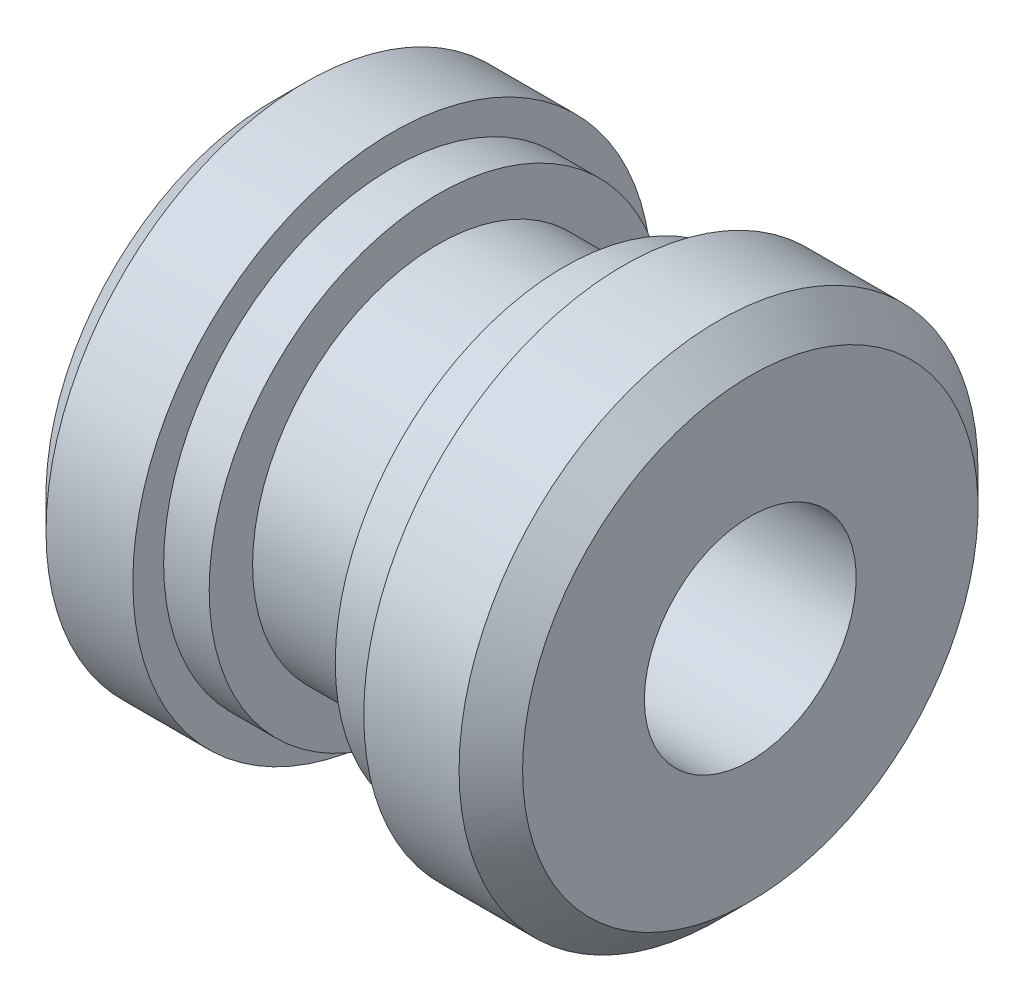
ISO-10303-21;
HEADER;
FILE_DESCRIPTION(('STEP AP214'),'2;1');
FILE_NAME('part.step','',(''),(''),'','','');
FILE_SCHEMA(('AUTOMOTIVE_DESIGN { 1 0 10303 214 1 1 1 1 }'));
ENDSEC;
DATA;
#1=APPLICATION_CONTEXT('core data for automotive mechanical design processes');
#2=APPLICATION_PROTOCOL_DEFINITION('international standard','automotive_design',2000,#1);
#3=PRODUCT_CONTEXT('',#1,'mechanical');
#4=PRODUCT('Part','Part','',(#3));
#5=PRODUCT_RELATED_PRODUCT_CATEGORY('part','',(#4));
#6=PRODUCT_DEFINITION_FORMATION('','',#4);
#7=PRODUCT_DEFINITION_CONTEXT('part definition',#1,'design');
#8=PRODUCT_DEFINITION('design','',#6,#7);
#9=PRODUCT_DEFINITION_SHAPE('','',#8);
#10=(LENGTH_UNIT() NAMED_UNIT(*) SI_UNIT(.MILLI.,.METRE.));
#11=(NAMED_UNIT(*) PLANE_ANGLE_UNIT() SI_UNIT($,.RADIAN.));
#12=(NAMED_UNIT(*) SI_UNIT($,.STERADIAN.) SOLID_ANGLE_UNIT());
#13=UNCERTAINTY_MEASURE_WITH_UNIT(LENGTH_MEASURE(1.E-05),#10,'distance_accuracy_value','');
#14=(GEOMETRIC_REPRESENTATION_CONTEXT(3) GLOBAL_UNCERTAINTY_ASSIGNED_CONTEXT((#13)) GLOBAL_UNIT_ASSIGNED_CONTEXT((#10,
#11,#12)) REPRESENTATION_CONTEXT('',''));
#15=CARTESIAN_POINT('',(0.,0.,0.));
#16=DIRECTION('',(0.,0.,1.));
#17=DIRECTION('',(1.,0.,0.));
#18=AXIS2_PLACEMENT_3D('',#15,#16,#17);
#19=CARTESIAN_POINT('',(0.,0.,0.));
#20=DIRECTION('',(-1.,0.,0.));
#21=DIRECTION('',(0.,0.,1.));
#22=AXIS2_PLACEMENT_3D('',#19,#20,#21);
#23=CYLINDRICAL_SURFACE('',#22,10.);
#24=CARTESIAN_POINT('',(45.,0.,0.));
#25=DIRECTION('',(-1.,0.,0.));
#26=DIRECTION('',(0.,0.,1.));
#27=AXIS2_PLACEMENT_3D('',#24,#25,#26);
#28=CIRCLE('',#27,10.);
#29=CARTESIAN_POINT('',(45.,0.,10.));
#30=VERTEX_POINT('',#29);
#31=EDGE_CURVE('E82',#30,#30,#28,.T.);
#32=ORIENTED_EDGE('',*,*,#31,.F.);
#33=EDGE_LOOP('',(#32));
#34=FACE_BOUND('',#33,.T.);
#35=CARTESIAN_POINT('',(0.,0.,0.));
#36=DIRECTION('',(-1.,0.,0.));
#37=DIRECTION('',(0.,0.,1.));
#38=AXIS2_PLACEMENT_3D('',#35,#36,#37);
#39=CIRCLE('',#38,10.);
#40=CARTESIAN_POINT('',(0.,0.,10.));
#41=VERTEX_POINT('',#40);
#42=EDGE_CURVE('E55',#41,#41,#39,.T.);
#43=ORIENTED_EDGE('',*,*,#42,.T.);
#44=EDGE_LOOP('',(#43));
#45=FACE_BOUND('',#44,.T.);
#46=ADVANCED_FACE('F35',(#34,#45),#23,.F.);
#47=CARTESIAN_POINT('',(0.,10.,0.));
#48=DIRECTION('',(1.,0.,0.));
#49=DIRECTION('',(0.,0.,-1.));
#50=AXIS2_PLACEMENT_3D('',#47,#48,#49);
#51=PLANE('',#50);
#52=CARTESIAN_POINT('',(0.,0.,0.));
#53=DIRECTION('',(1.,0.,0.));
#54=DIRECTION('',(0.,0.,-1.));
#55=AXIS2_PLACEMENT_3D('',#52,#53,#54);
#56=CIRCLE('',#55,21.5);
#57=CARTESIAN_POINT('',(0.,0.,-21.5));
#58=VERTEX_POINT('',#57);
#59=EDGE_CURVE('E42',#58,#58,#56,.F.);
#60=ORIENTED_EDGE('',*,*,#59,.T.);
#61=EDGE_LOOP('',(#60));
#62=FACE_BOUND('',#61,.T.);
#63=ORIENTED_EDGE('',*,*,#42,.F.);
#64=EDGE_LOOP('',(#63));
#65=FACE_BOUND('',#64,.T.);
#66=ADVANCED_FACE('F90',(#62,#65),#51,.F.);
#67=CARTESIAN_POINT('',(0.,0.,0.));
#68=DIRECTION('',(-1.,0.,0.));
#69=DIRECTION('',(0.,0.,1.));
#70=AXIS2_PLACEMENT_3D('',#67,#68,#69);
#71=CYLINDRICAL_SURFACE('',#70,24.5);
#72=CARTESIAN_POINT('',(3.,0.,0.));
#73=DIRECTION('',(1.,0.,0.));
#74=DIRECTION('',(0.,0.,-1.));
#75=AXIS2_PLACEMENT_3D('',#72,#73,#74);
#76=CIRCLE('',#75,24.5);
#77=CARTESIAN_POINT('',(3.,0.,-24.5));
#78=VERTEX_POINT('',#77);
#79=EDGE_CURVE('E10',#78,#78,#76,.T.);
#80=ORIENTED_EDGE('',*,*,#79,.T.);
#81=EDGE_LOOP('',(#80));
#82=FACE_BOUND('',#81,.T.);
#83=CARTESIAN_POINT('',(11.1974430992805,0.,0.));
#84=DIRECTION('',(-1.,0.,0.));
#85=DIRECTION('',(0.,0.,1.));
#86=AXIS2_PLACEMENT_3D('',#83,#84,#85);
#87=CIRCLE('',#86,24.5);
#88=CARTESIAN_POINT('',(11.1974430992805,0.,24.5));
#89=VERTEX_POINT('',#88);
#90=EDGE_CURVE('E58',#89,#89,#87,.T.);
#91=ORIENTED_EDGE('',*,*,#90,.T.);
#92=EDGE_LOOP('',(#91));
#93=FACE_BOUND('',#92,.T.);
#94=ADVANCED_FACE('F95',(#82,#93),#71,.T.);
#95=CARTESIAN_POINT('',(11.1974430992805,24.5,0.));
#96=DIRECTION('',(-1.,0.,0.));
#97=DIRECTION('',(0.,0.,1.));
#98=AXIS2_PLACEMENT_3D('',#95,#96,#97);
#99=PLANE('',#98);
#100=ORIENTED_EDGE('',*,*,#90,.F.);
#101=EDGE_LOOP('',(#100));
#102=FACE_BOUND('',#101,.T.);
#103=CARTESIAN_POINT('',(11.1974430992805,0.,0.));
#104=DIRECTION('',(-1.,0.,0.));
#105=DIRECTION('',(0.,0.,1.));
#106=AXIS2_PLACEMENT_3D('',#103,#104,#105);
#107=CIRCLE('',#106,21.5912270213506);
#108=CARTESIAN_POINT('',(11.1974430992805,0.,21.5912270213506));
#109=VERTEX_POINT('',#108);
#110=EDGE_CURVE('E61',#109,#109,#107,.T.);
#111=ORIENTED_EDGE('',*,*,#110,.T.);
#112=EDGE_LOOP('',(#111));
#113=FACE_BOUND('',#112,.T.);
#114=ADVANCED_FACE('F100',(#102,#113),#99,.F.);
#115=CARTESIAN_POINT('',(0.,0.,0.));
#116=DIRECTION('',(-1.,0.,0.));
#117=DIRECTION('',(0.,0.,1.));
#118=AXIS2_PLACEMENT_3D('',#115,#116,#117);
#119=CYLINDRICAL_SURFACE('',#118,21.5912270213506);
#120=ORIENTED_EDGE('',*,*,#110,.F.);
#121=EDGE_LOOP('',(#120));
#122=FACE_BOUND('',#121,.T.);
#123=CARTESIAN_POINT('',(15.4983136040948,0.,0.));
#124=DIRECTION('',(-1.,0.,0.));
#125=DIRECTION('',(0.,0.,1.));
#126=AXIS2_PLACEMENT_3D('',#123,#124,#125);
#127=CIRCLE('',#126,21.5912270213506);
#128=CARTESIAN_POINT('',(15.4983136040948,0.,21.5912270213506));
#129=VERTEX_POINT('',#128);
#130=EDGE_CURVE('E64',#129,#129,#127,.T.);
#131=ORIENTED_EDGE('',*,*,#130,.T.);
#132=EDGE_LOOP('',(#131));
#133=FACE_BOUND('',#132,.T.);
#134=ADVANCED_FACE('F146',(#122,#133),#119,.T.);
#135=CARTESIAN_POINT('',(15.4983136040948,21.5912270213506,0.));
#136=DIRECTION('',(-1.,0.,0.));
#137=DIRECTION('',(0.,0.,1.));
#138=AXIS2_PLACEMENT_3D('',#135,#136,#137);
#139=PLANE('',#138);
#140=ORIENTED_EDGE('',*,*,#130,.F.);
#141=EDGE_LOOP('',(#140));
#142=FACE_BOUND('',#141,.T.);
#143=CARTESIAN_POINT('',(15.4983136040948,0.,0.));
#144=DIRECTION('',(-1.,0.,0.));
#145=DIRECTION('',(0.,0.,1.));
#146=AXIS2_PLACEMENT_3D('',#143,#144,#145);
#147=CIRCLE('',#146,17.4903970051323);
#148=CARTESIAN_POINT('',(15.4983136040948,0.,17.4903970051323));
#149=VERTEX_POINT('',#148);
#150=EDGE_CURVE('E67',#149,#149,#147,.T.);
#151=ORIENTED_EDGE('',*,*,#150,.T.);
#152=EDGE_LOOP('',(#151));
#153=FACE_BOUND('',#152,.T.);
#154=ADVANCED_FACE('F142',(#142,#153),#139,.F.);
#155=CARTESIAN_POINT('',(0.,0.,0.));
#156=DIRECTION('',(-1.,0.,0.));
#157=DIRECTION('',(0.,0.,1.));
#158=AXIS2_PLACEMENT_3D('',#155,#156,#157);
#159=CYLINDRICAL_SURFACE('',#158,17.4903970051323);
#160=ORIENTED_EDGE('',*,*,#150,.F.);
#161=EDGE_LOOP('',(#160));
#162=FACE_BOUND('',#161,.T.);
#163=CARTESIAN_POINT('',(27.4007226755578,0.,0.));
#164=DIRECTION('',(-1.,0.,0.));
#165=DIRECTION('',(0.,0.,1.));
#166=AXIS2_PLACEMENT_3D('',#163,#164,#165);
#167=CIRCLE('',#166,17.4903970051323);
#168=CARTESIAN_POINT('',(27.4007226755578,0.,17.4903970051323));
#169=VERTEX_POINT('',#168);
#170=EDGE_CURVE('E70',#169,#169,#167,.T.);
#171=ORIENTED_EDGE('',*,*,#170,.T.);
#172=EDGE_LOOP('',(#171));
#173=FACE_BOUND('',#172,.T.);
#174=ADVANCED_FACE('F138',(#162,#173),#159,.T.);
#175=CARTESIAN_POINT('',(27.4007226755578,17.4903970051323,0.));
#176=DIRECTION('',(1.,0.,0.));
#177=DIRECTION('',(0.,0.,-1.));
#178=AXIS2_PLACEMENT_3D('',#175,#176,#177);
#179=PLANE('',#178);
#180=ORIENTED_EDGE('',*,*,#170,.F.);
#181=EDGE_LOOP('',(#180));
#182=FACE_BOUND('',#181,.T.);
#183=CARTESIAN_POINT('',(27.4007226755578,0.,0.));
#184=DIRECTION('',(-1.,0.,0.));
#185=DIRECTION('',(0.,0.,1.));
#186=AXIS2_PLACEMENT_3D('',#183,#184,#185);
#187=CIRCLE('',#186,21.5912270213506);
#188=CARTESIAN_POINT('',(27.4007226755578,0.,21.5912270213506));
#189=VERTEX_POINT('',#188);
#190=EDGE_CURVE('E73',#189,#189,#187,.T.);
#191=ORIENTED_EDGE('',*,*,#190,.T.);
#192=EDGE_LOOP('',(#191));
#193=FACE_BOUND('',#192,.T.);
#194=ADVANCED_FACE('F131',(#182,#193),#179,.F.);
#195=CARTESIAN_POINT('',(0.,0.,0.));
#196=DIRECTION('',(-1.,0.,0.));
#197=DIRECTION('',(0.,0.,1.));
#198=AXIS2_PLACEMENT_3D('',#195,#196,#197);
#199=CYLINDRICAL_SURFACE('',#198,21.5912270213506);
#200=ORIENTED_EDGE('',*,*,#190,.F.);
#201=EDGE_LOOP('',(#200));
#202=FACE_BOUND('',#201,.T.);
#203=CARTESIAN_POINT('',(33.0018563562462,0.,0.));
#204=DIRECTION('',(-1.,0.,0.));
#205=DIRECTION('',(0.,0.,1.));
#206=AXIS2_PLACEMENT_3D('',#203,#204,#205);
#207=CIRCLE('',#206,21.5912270213506);
#208=CARTESIAN_POINT('',(33.0018563562462,0.,21.5912270213506));
#209=VERTEX_POINT('',#208);
#210=EDGE_CURVE('E76',#209,#209,#207,.T.);
#211=ORIENTED_EDGE('',*,*,#210,.T.);
#212=EDGE_LOOP('',(#211));
#213=FACE_BOUND('',#212,.T.);
#214=ADVANCED_FACE('F125',(#202,#213),#199,.T.);
#215=CARTESIAN_POINT('',(33.0018563562462,21.5912270213506,0.));
#216=DIRECTION('',(1.,0.,0.));
#217=DIRECTION('',(0.,0.,-1.));
#218=AXIS2_PLACEMENT_3D('',#215,#216,#217);
#219=PLANE('',#218);
#220=ORIENTED_EDGE('',*,*,#210,.F.);
#221=EDGE_LOOP('',(#220));
#222=FACE_BOUND('',#221,.T.);
#223=CARTESIAN_POINT('',(33.0018563562462,0.,0.));
#224=DIRECTION('',(-1.,0.,0.));
#225=DIRECTION('',(0.,0.,1.));
#226=AXIS2_PLACEMENT_3D('',#223,#224,#225);
#227=CIRCLE('',#226,24.5);
#228=CARTESIAN_POINT('',(33.0018563562462,0.,24.5));
#229=VERTEX_POINT('',#228);
#230=EDGE_CURVE('E79',#229,#229,#227,.T.);
#231=ORIENTED_EDGE('',*,*,#230,.T.);
#232=EDGE_LOOP('',(#231));
#233=FACE_BOUND('',#232,.T.);
#234=ADVANCED_FACE('F120',(#222,#233),#219,.F.);
#235=CARTESIAN_POINT('',(0.,0.,0.));
#236=DIRECTION('',(-1.,0.,0.));
#237=DIRECTION('',(0.,0.,1.));
#238=AXIS2_PLACEMENT_3D('',#235,#236,#237);
#239=CYLINDRICAL_SURFACE('',#238,24.5);
#240=CARTESIAN_POINT('',(42.,0.,0.));
#241=DIRECTION('',(-1.,0.,0.));
#242=DIRECTION('',(0.,0.,1.));
#243=AXIS2_PLACEMENT_3D('',#240,#241,#242);
#244=CIRCLE('',#243,24.5);
#245=CARTESIAN_POINT('',(42.,0.,24.5));
#246=VERTEX_POINT('',#245);
#247=EDGE_CURVE('E50',#246,#246,#244,.T.);
#248=ORIENTED_EDGE('',*,*,#247,.T.);
#249=EDGE_LOOP('',(#248));
#250=FACE_BOUND('',#249,.T.);
#251=ORIENTED_EDGE('',*,*,#230,.F.);
#252=EDGE_LOOP('',(#251));
#253=FACE_BOUND('',#252,.T.);
#254=ADVANCED_FACE('F111',(#250,#253),#239,.T.);
#255=CARTESIAN_POINT('',(45.,24.5,0.));
#256=DIRECTION('',(-1.,0.,0.));
#257=DIRECTION('',(0.,0.,1.));
#258=AXIS2_PLACEMENT_3D('',#255,#256,#257);
#259=PLANE('',#258);
#260=CARTESIAN_POINT('',(45.,0.,0.));
#261=DIRECTION('',(-1.,0.,0.));
#262=DIRECTION('',(0.,0.,1.));
#263=AXIS2_PLACEMENT_3D('',#260,#261,#262);
#264=CIRCLE('',#263,21.5);
#265=CARTESIAN_POINT('',(45.,0.,21.5));
#266=VERTEX_POINT('',#265);
#267=EDGE_CURVE('E46',#266,#266,#264,.F.);
#268=ORIENTED_EDGE('',*,*,#267,.T.);
#269=EDGE_LOOP('',(#268));
#270=FACE_BOUND('',#269,.T.);
#271=ORIENTED_EDGE('',*,*,#31,.T.);
#272=EDGE_LOOP('',(#271));
#273=FACE_BOUND('',#272,.T.);
#274=ADVANCED_FACE('F86',(#270,#273),#259,.F.);
#275=CARTESIAN_POINT('',(42.,0.,0.));
#276=DIRECTION('',(-1.,0.,0.));
#277=DIRECTION('',(0.,0.,1.));
#278=AXIS2_PLACEMENT_3D('',#275,#276,#277);
#279=CONICAL_SURFACE('',#278,24.5,0.785398163397454);
#280=ORIENTED_EDGE('',*,*,#267,.F.);
#281=EDGE_LOOP('',(#280));
#282=FACE_BOUND('',#281,.T.);
#283=ORIENTED_EDGE('',*,*,#247,.F.);
#284=EDGE_LOOP('',(#283));
#285=FACE_BOUND('',#284,.T.);
#286=ADVANCED_FACE('F103',(#282,#285),#279,.T.);
#287=CARTESIAN_POINT('',(0.,0.,0.));
#288=DIRECTION('',(1.,0.,0.));
#289=DIRECTION('',(0.,0.,-1.));
#290=AXIS2_PLACEMENT_3D('',#287,#288,#289);
#291=CONICAL_SURFACE('',#290,21.5,0.785398163397448);
#292=ORIENTED_EDGE('',*,*,#79,.F.);
#293=EDGE_LOOP('',(#292));
#294=FACE_BOUND('',#293,.T.);
#295=ORIENTED_EDGE('',*,*,#59,.F.);
#296=EDGE_LOOP('',(#295));
#297=FACE_BOUND('',#296,.T.);
#298=ADVANCED_FACE('F37',(#294,#297),#291,.T.);
#299=CLOSED_SHELL('',(#46,#66,#94,#114,#134,#154,#174,#194,#214,#234,#254,#274,#286,#298));
#300=MANIFOLD_SOLID_BREP('B2',#299);
#301=ADVANCED_BREP_SHAPE_REPRESENTATION('',(#18,#300),#14);
#302=SHAPE_DEFINITION_REPRESENTATION(#9,#301);
ENDSEC;
END-ISO-10303-21;
